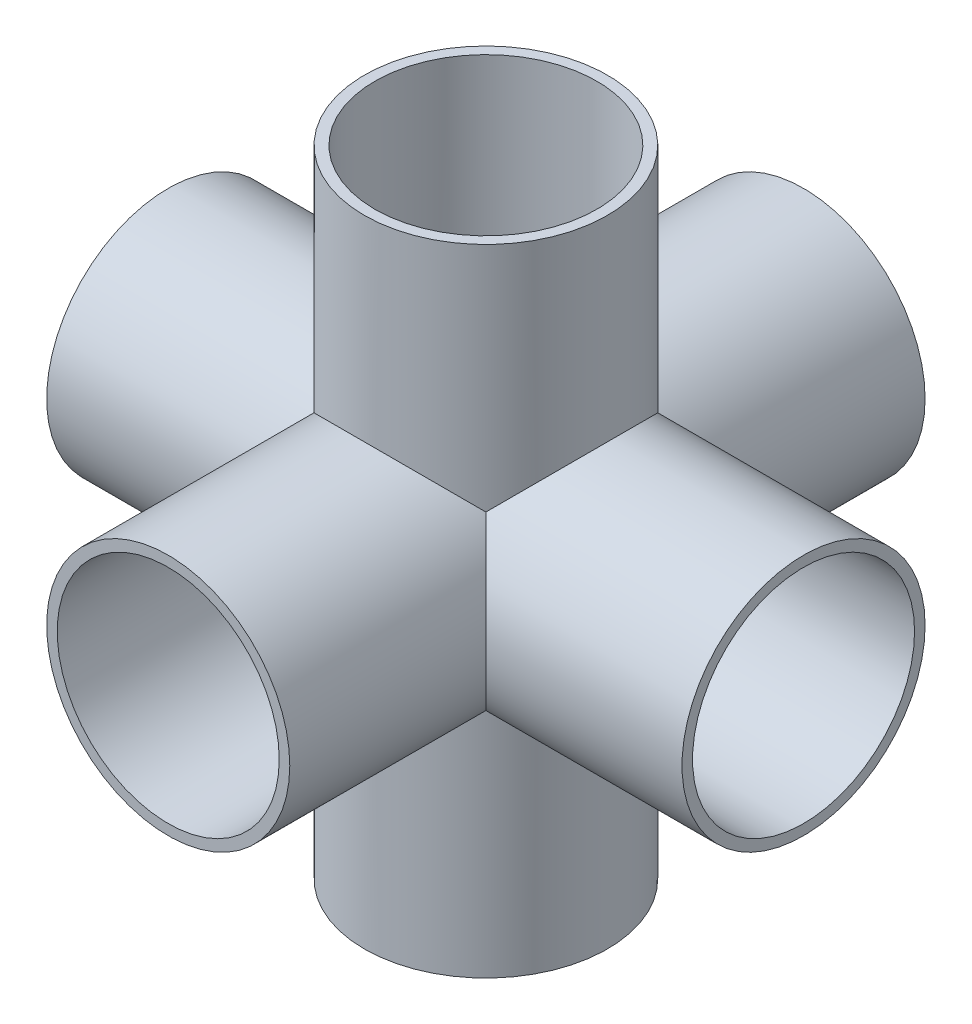
ISO-10303-21;
HEADER;
FILE_DESCRIPTION(('STEP AP214'),'2;1');
FILE_NAME('part.step','',(''),(''),'','','');
FILE_SCHEMA(('AUTOMOTIVE_DESIGN { 1 0 10303 214 1 1 1 1 }'));
ENDSEC;
DATA;
#1=APPLICATION_CONTEXT('core data for automotive mechanical design processes');
#2=APPLICATION_PROTOCOL_DEFINITION('international standard','automotive_design',2000,#1);
#3=PRODUCT_CONTEXT('',#1,'mechanical');
#4=PRODUCT('Part','Part','',(#3));
#5=PRODUCT_RELATED_PRODUCT_CATEGORY('part','',(#4));
#6=PRODUCT_DEFINITION_FORMATION('','',#4);
#7=PRODUCT_DEFINITION_CONTEXT('part definition',#1,'design');
#8=PRODUCT_DEFINITION('design','',#6,#7);
#9=PRODUCT_DEFINITION_SHAPE('','',#8);
#10=(LENGTH_UNIT() NAMED_UNIT(*) SI_UNIT(.MILLI.,.METRE.));
#11=(NAMED_UNIT(*) PLANE_ANGLE_UNIT() SI_UNIT($,.RADIAN.));
#12=(NAMED_UNIT(*) SI_UNIT($,.STERADIAN.) SOLID_ANGLE_UNIT());
#13=UNCERTAINTY_MEASURE_WITH_UNIT(LENGTH_MEASURE(1.E-05),#10,'distance_accuracy_value','');
#14=(GEOMETRIC_REPRESENTATION_CONTEXT(3) GLOBAL_UNCERTAINTY_ASSIGNED_CONTEXT((#13)) GLOBAL_UNIT_ASSIGNED_CONTEXT((#10,
#11,#12)) REPRESENTATION_CONTEXT('',''));
#15=CARTESIAN_POINT('',(0.,0.,0.));
#16=DIRECTION('',(0.,0.,1.));
#17=DIRECTION('',(1.,0.,0.));
#18=AXIS2_PLACEMENT_3D('',#15,#16,#17);
#19=CARTESIAN_POINT('',(0.,-49.784,0.));
#20=DIRECTION('',(0.,1.,0.));
#21=DIRECTION('',(0.,0.,1.));
#22=AXIS2_PLACEMENT_3D('',#19,#20,#21);
#23=CYLINDRICAL_SURFACE('',#22,17.399);
#24=CARTESIAN_POINT('',(0.,49.784,0.));
#25=DIRECTION('',(0.,1.,0.));
#26=DIRECTION('',(0.,0.,1.));
#27=AXIS2_PLACEMENT_3D('',#24,#25,#26);
#28=CIRCLE('',#27,17.399);
#29=CARTESIAN_POINT('',(0.,49.784,17.399));
#30=VERTEX_POINT('',#29);
#31=EDGE_CURVE('E137',#30,#30,#28,.T.);
#32=ORIENTED_EDGE('',*,*,#31,.T.);
#33=EDGE_LOOP('',(#32));
#34=FACE_BOUND('',#33,.T.);
#35=CARTESIAN_POINT('',(0.,0.,0.));
#36=DIRECTION('',(0.707106781186547,0.707106781186547,0.));
#37=DIRECTION('',(-0.707106781186547,0.707106781186547,0.));
#38=AXIS2_PLACEMENT_3D('',#35,#36,#37);
#39=ELLIPSE('',#38,24.6059017717295,17.399);
#40=CARTESIAN_POINT('',(-12.3029508858647,12.3029508858647,12.3029508858647));
#41=VERTEX_POINT('',#40);
#42=CARTESIAN_POINT('',(-12.3029508858647,12.3029508858647,-12.3029508858647));
#43=VERTEX_POINT('',#42);
#44=EDGE_CURVE('E99',#41,#43,#39,.F.);
#45=ORIENTED_EDGE('',*,*,#44,.T.);
#46=CARTESIAN_POINT('',(0.,0.,0.));
#47=DIRECTION('',(0.,0.707106781186547,0.707106781186547));
#48=DIRECTION('',(0.,0.707106781186547,-0.707106781186547));
#49=AXIS2_PLACEMENT_3D('',#46,#47,#48);
#50=ELLIPSE('',#49,24.6059017717295,17.399);
#51=CARTESIAN_POINT('',(12.3029508858647,12.3029508858647,-12.3029508858647));
#52=VERTEX_POINT('',#51);
#53=EDGE_CURVE('E45',#43,#52,#50,.F.);
#54=ORIENTED_EDGE('',*,*,#53,.T.);
#55=CARTESIAN_POINT('',(0.,0.,0.));
#56=DIRECTION('',(-0.707106781186547,0.707106781186547,0.));
#57=DIRECTION('',(0.707106781186547,0.707106781186547,0.));
#58=AXIS2_PLACEMENT_3D('',#55,#56,#57);
#59=ELLIPSE('',#58,24.6059017717295,17.399);
#60=CARTESIAN_POINT('',(12.3029508858647,12.3029508858647,12.3029508858647));
#61=VERTEX_POINT('',#60);
#62=EDGE_CURVE('E111',#52,#61,#59,.F.);
#63=ORIENTED_EDGE('',*,*,#62,.T.);
#64=CARTESIAN_POINT('',(0.,0.,0.));
#65=DIRECTION('',(0.,0.707106781186547,-0.707106781186547));
#66=DIRECTION('',(0.,0.707106781186547,0.707106781186547));
#67=AXIS2_PLACEMENT_3D('',#64,#65,#66);
#68=ELLIPSE('',#67,24.6059017717295,17.399);
#69=EDGE_CURVE('E122',#61,#41,#68,.F.);
#70=ORIENTED_EDGE('',*,*,#69,.T.);
#71=EDGE_LOOP('',(#45,#54,#63,#70));
#72=FACE_BOUND('',#71,.T.);
#73=ADVANCED_FACE('F30',(#34,#72),#23,.F.);
#74=CARTESIAN_POINT('',(0.,-49.784,0.));
#75=DIRECTION('',(0.,1.,0.));
#76=DIRECTION('',(0.,0.,1.));
#77=AXIS2_PLACEMENT_3D('',#74,#75,#76);
#78=CYLINDRICAL_SURFACE('',#77,19.05);
#79=CARTESIAN_POINT('',(0.,0.,0.));
#80=DIRECTION('',(0.707106781186547,0.707106781186547,0.));
#81=DIRECTION('',(-0.707106781186547,0.707106781186547,0.));
#82=AXIS2_PLACEMENT_3D('',#79,#80,#81);
#83=ELLIPSE('',#82,26.9407683632075,19.05);
#84=CARTESIAN_POINT('',(13.4703841816037,-13.4703841816037,13.4703841816037));
#85=VERTEX_POINT('',#84);
#86=CARTESIAN_POINT('',(13.4703841816037,-13.4703841816037,-13.4703841816037));
#87=VERTEX_POINT('',#86);
#88=EDGE_CURVE('E164',#85,#87,#83,.T.);
#89=ORIENTED_EDGE('',*,*,#88,.F.);
#90=CARTESIAN_POINT('',(0.,0.,0.));
#91=DIRECTION('',(0.,0.707106781186547,0.707106781186547));
#92=DIRECTION('',(0.,0.707106781186547,-0.707106781186547));
#93=AXIS2_PLACEMENT_3D('',#90,#91,#92);
#94=ELLIPSE('',#93,26.9407683632075,19.05);
#95=CARTESIAN_POINT('',(-13.4703841816037,-13.4703841816037,13.4703841816037));
#96=VERTEX_POINT('',#95);
#97=EDGE_CURVE('E184',#96,#85,#94,.T.);
#98=ORIENTED_EDGE('',*,*,#97,.F.);
#99=CARTESIAN_POINT('',(0.,0.,0.));
#100=DIRECTION('',(-0.707106781186547,0.707106781186547,0.));
#101=DIRECTION('',(0.707106781186547,0.707106781186547,0.));
#102=AXIS2_PLACEMENT_3D('',#99,#100,#101);
#103=ELLIPSE('',#102,26.9407683632075,19.05);
#104=CARTESIAN_POINT('',(-13.4703841816037,-13.4703841816037,-13.4703841816037));
#105=VERTEX_POINT('',#104);
#106=EDGE_CURVE('E155',#105,#96,#103,.T.);
#107=ORIENTED_EDGE('',*,*,#106,.F.);
#108=CARTESIAN_POINT('',(0.,0.,0.));
#109=DIRECTION('',(0.,0.707106781186547,-0.707106781186547));
#110=DIRECTION('',(0.,0.707106781186547,0.707106781186547));
#111=AXIS2_PLACEMENT_3D('',#108,#109,#110);
#112=ELLIPSE('',#111,26.9407683632075,19.05);
#113=EDGE_CURVE('E182',#87,#105,#112,.T.);
#114=ORIENTED_EDGE('',*,*,#113,.F.);
#115=EDGE_LOOP('',(#89,#98,#107,#114));
#116=FACE_BOUND('',#115,.T.);
#117=CARTESIAN_POINT('',(0.,-49.784,0.));
#118=DIRECTION('',(0.,1.,0.));
#119=DIRECTION('',(0.,0.,1.));
#120=AXIS2_PLACEMENT_3D('',#117,#118,#119);
#121=CIRCLE('',#120,19.05);
#122=CARTESIAN_POINT('',(0.,-49.784,19.05));
#123=VERTEX_POINT('',#122);
#124=EDGE_CURVE('E176',#123,#123,#121,.T.);
#125=ORIENTED_EDGE('',*,*,#124,.T.);
#126=EDGE_LOOP('',(#125));
#127=FACE_BOUND('',#126,.T.);
#128=ADVANCED_FACE('F32',(#116,#127),#78,.T.);
#129=CARTESIAN_POINT('',(0.,-49.784,0.));
#130=DIRECTION('',(0.,1.,0.));
#131=DIRECTION('',(0.,0.,1.));
#132=AXIS2_PLACEMENT_3D('',#129,#130,#131);
#133=PLANE('',#132);
#134=CARTESIAN_POINT('',(0.,-49.784,0.));
#135=DIRECTION('',(0.,1.,0.));
#136=DIRECTION('',(0.,0.,1.));
#137=AXIS2_PLACEMENT_3D('',#134,#135,#136);
#138=CIRCLE('',#137,17.399);
#139=CARTESIAN_POINT('',(0.,-49.784,17.399));
#140=VERTEX_POINT('',#139);
#141=EDGE_CURVE('E140',#140,#140,#138,.T.);
#142=ORIENTED_EDGE('',*,*,#141,.T.);
#143=EDGE_LOOP('',(#142));
#144=FACE_BOUND('',#143,.T.);
#145=ORIENTED_EDGE('',*,*,#124,.F.);
#146=EDGE_LOOP('',(#145));
#147=FACE_BOUND('',#146,.T.);
#148=ADVANCED_FACE('F222',(#144,#147),#133,.F.);
#149=CARTESIAN_POINT('',(0.,0.,49.784));
#150=DIRECTION('',(0.,0.,1.));
#151=DIRECTION('',(1.,0.,0.));
#152=AXIS2_PLACEMENT_3D('',#149,#150,#151);
#153=PLANE('',#152);
#154=CARTESIAN_POINT('',(0.,0.,49.784));
#155=DIRECTION('',(0.,0.,1.));
#156=DIRECTION('',(1.,0.,0.));
#157=AXIS2_PLACEMENT_3D('',#154,#155,#156);
#158=CIRCLE('',#157,17.399);
#159=CARTESIAN_POINT('',(17.399,0.,49.784));
#160=VERTEX_POINT('',#159);
#161=EDGE_CURVE('E355',#160,#160,#158,.T.);
#162=ORIENTED_EDGE('',*,*,#161,.F.);
#163=EDGE_LOOP('',(#162));
#164=FACE_BOUND('',#163,.T.);
#165=CARTESIAN_POINT('',(0.,0.,49.784));
#166=DIRECTION('',(0.,0.,1.));
#167=DIRECTION('',(1.,0.,0.));
#168=AXIS2_PLACEMENT_3D('',#165,#166,#167);
#169=CIRCLE('',#168,19.05);
#170=CARTESIAN_POINT('',(19.05,0.,49.784));
#171=VERTEX_POINT('',#170);
#172=EDGE_CURVE('E167',#171,#171,#169,.T.);
#173=ORIENTED_EDGE('',*,*,#172,.T.);
#174=EDGE_LOOP('',(#173));
#175=FACE_BOUND('',#174,.T.);
#176=ADVANCED_FACE('F217',(#164,#175),#153,.T.);
#177=CARTESIAN_POINT('',(0.,0.,-49.784));
#178=DIRECTION('',(0.,0.,1.));
#179=DIRECTION('',(1.,0.,0.));
#180=AXIS2_PLACEMENT_3D('',#177,#178,#179);
#181=CYLINDRICAL_SURFACE('',#180,19.05);
#182=CARTESIAN_POINT('',(0.,0.,0.));
#183=DIRECTION('',(0.707106781186547,0.,0.707106781186547));
#184=DIRECTION('',(-0.707106781186547,0.,0.707106781186547));
#185=AXIS2_PLACEMENT_3D('',#182,#183,#184);
#186=ELLIPSE('',#185,26.9407683632075,19.05);
#187=CARTESIAN_POINT('',(-13.4703841816037,13.4703841816037,13.4703841816037));
#188=VERTEX_POINT('',#187);
#189=EDGE_CURVE('E152',#96,#188,#186,.F.);
#190=ORIENTED_EDGE('',*,*,#189,.F.);
#191=ORIENTED_EDGE('',*,*,#97,.T.);
#192=CARTESIAN_POINT('',(0.,0.,0.));
#193=DIRECTION('',(-0.707106781186547,0.,0.707106781186547));
#194=DIRECTION('',(0.707106781186547,0.,0.707106781186547));
#195=AXIS2_PLACEMENT_3D('',#192,#193,#194);
#196=ELLIPSE('',#195,26.9407683632075,19.05);
#197=CARTESIAN_POINT('',(13.4703841816037,13.4703841816037,13.4703841816037));
#198=VERTEX_POINT('',#197);
#199=EDGE_CURVE('E161',#198,#85,#196,.F.);
#200=ORIENTED_EDGE('',*,*,#199,.F.);
#201=CARTESIAN_POINT('',(0.,0.,0.));
#202=DIRECTION('',(0.,0.707106781186547,-0.707106781186547));
#203=DIRECTION('',(0.,0.707106781186547,0.707106781186547));
#204=AXIS2_PLACEMENT_3D('',#201,#202,#203);
#205=ELLIPSE('',#204,26.9407683632075,19.05);
#206=EDGE_CURVE('E179',#198,#188,#205,.F.);
#207=ORIENTED_EDGE('',*,*,#206,.T.);
#208=EDGE_LOOP('',(#190,#191,#200,#207));
#209=FACE_BOUND('',#208,.T.);
#210=ORIENTED_EDGE('',*,*,#172,.F.);
#211=EDGE_LOOP('',(#210));
#212=FACE_BOUND('',#211,.T.);
#213=ADVANCED_FACE('F213',(#209,#212),#181,.T.);
#214=CARTESIAN_POINT('',(0.,49.784,0.));
#215=DIRECTION('',(0.,1.,0.));
#216=DIRECTION('',(0.,0.,1.));
#217=AXIS2_PLACEMENT_3D('',#214,#215,#216);
#218=PLANE('',#217);
#219=ORIENTED_EDGE('',*,*,#31,.F.);
#220=EDGE_LOOP('',(#219));
#221=FACE_BOUND('',#220,.T.);
#222=CARTESIAN_POINT('',(0.,49.784,0.));
#223=DIRECTION('',(0.,1.,0.));
#224=DIRECTION('',(0.,0.,1.));
#225=AXIS2_PLACEMENT_3D('',#222,#223,#224);
#226=CIRCLE('',#225,19.05);
#227=CARTESIAN_POINT('',(0.,49.784,19.05));
#228=VERTEX_POINT('',#227);
#229=EDGE_CURVE('E173',#228,#228,#226,.T.);
#230=ORIENTED_EDGE('',*,*,#229,.T.);
#231=EDGE_LOOP('',(#230));
#232=FACE_BOUND('',#231,.T.);
#233=ADVANCED_FACE('F216',(#221,#232),#218,.T.);
#234=CARTESIAN_POINT('',(0.,0.,0.));
#235=DIRECTION('',(0.707106781186547,0.707106781186547,0.));
#236=DIRECTION('',(-0.707106781186547,0.707106781186547,0.));
#237=AXIS2_PLACEMENT_3D('',#234,#235,#236);
#238=ELLIPSE('',#237,26.9407683632075,19.05);
#239=CARTESIAN_POINT('',(-13.4703841816037,13.4703841816037,-13.4703841816037));
#240=VERTEX_POINT('',#239);
#241=EDGE_CURVE('E149',#188,#240,#238,.F.);
#242=ORIENTED_EDGE('',*,*,#241,.F.);
#243=ORIENTED_EDGE('',*,*,#206,.F.);
#244=CARTESIAN_POINT('',(0.,0.,0.));
#245=DIRECTION('',(-0.707106781186547,0.707106781186547,0.));
#246=DIRECTION('',(0.707106781186547,0.707106781186547,0.));
#247=AXIS2_PLACEMENT_3D('',#244,#245,#246);
#248=ELLIPSE('',#247,26.9407683632075,19.05);
#249=CARTESIAN_POINT('',(13.4703841816037,13.4703841816037,-13.4703841816037));
#250=VERTEX_POINT('',#249);
#251=EDGE_CURVE('E158',#250,#198,#248,.F.);
#252=ORIENTED_EDGE('',*,*,#251,.F.);
#253=CARTESIAN_POINT('',(0.,0.,0.));
#254=DIRECTION('',(0.,0.707106781186547,0.707106781186547));
#255=DIRECTION('',(0.,0.707106781186547,-0.707106781186547));
#256=AXIS2_PLACEMENT_3D('',#253,#254,#255);
#257=ELLIPSE('',#256,26.9407683632075,19.05);
#258=EDGE_CURVE('E187',#240,#250,#257,.F.);
#259=ORIENTED_EDGE('',*,*,#258,.F.);
#260=EDGE_LOOP('',(#242,#243,#252,#259));
#261=FACE_BOUND('',#260,.T.);
#262=ORIENTED_EDGE('',*,*,#229,.F.);
#263=EDGE_LOOP('',(#262));
#264=FACE_BOUND('',#263,.T.);
#265=ADVANCED_FACE('F209',(#261,#264),#78,.T.);
#266=CARTESIAN_POINT('',(0.,0.,0.));
#267=DIRECTION('',(0.707106781186547,0.,0.707106781186547));
#268=DIRECTION('',(-0.707106781186547,0.,0.707106781186547));
#269=AXIS2_PLACEMENT_3D('',#266,#267,#268);
#270=ELLIPSE('',#269,26.9407683632075,19.05);
#271=EDGE_CURVE('E115',#87,#250,#270,.T.);
#272=ORIENTED_EDGE('',*,*,#271,.F.);
#273=ORIENTED_EDGE('',*,*,#113,.T.);
#274=CARTESIAN_POINT('',(0.,0.,0.));
#275=DIRECTION('',(-0.707106781186547,0.,0.707106781186547));
#276=DIRECTION('',(0.707106781186547,0.,0.707106781186547));
#277=AXIS2_PLACEMENT_3D('',#274,#275,#276);
#278=ELLIPSE('',#277,26.9407683632075,19.05);
#279=EDGE_CURVE('E189',#240,#105,#278,.T.);
#280=ORIENTED_EDGE('',*,*,#279,.F.);
#281=ORIENTED_EDGE('',*,*,#258,.T.);
#282=EDGE_LOOP('',(#272,#273,#280,#281));
#283=FACE_BOUND('',#282,.T.);
#284=CARTESIAN_POINT('',(0.,0.,-49.784));
#285=DIRECTION('',(0.,0.,1.));
#286=DIRECTION('',(1.,0.,0.));
#287=AXIS2_PLACEMENT_3D('',#284,#285,#286);
#288=CIRCLE('',#287,19.05);
#289=CARTESIAN_POINT('',(19.05,0.,-49.784));
#290=VERTEX_POINT('',#289);
#291=EDGE_CURVE('E170',#290,#290,#288,.T.);
#292=ORIENTED_EDGE('',*,*,#291,.T.);
#293=EDGE_LOOP('',(#292));
#294=FACE_BOUND('',#293,.T.);
#295=ADVANCED_FACE('F198',(#283,#294),#181,.T.);
#296=CARTESIAN_POINT('',(0.,0.,-49.784));
#297=DIRECTION('',(0.,0.,1.));
#298=DIRECTION('',(1.,0.,0.));
#299=AXIS2_PLACEMENT_3D('',#296,#297,#298);
#300=PLANE('',#299);
#301=CARTESIAN_POINT('',(0.,0.,-49.784));
#302=DIRECTION('',(0.,0.,1.));
#303=DIRECTION('',(1.,0.,0.));
#304=AXIS2_PLACEMENT_3D('',#301,#302,#303);
#305=CIRCLE('',#304,17.399);
#306=CARTESIAN_POINT('',(17.399,0.,-49.784));
#307=VERTEX_POINT('',#306);
#308=EDGE_CURVE('E108',#307,#307,#305,.T.);
#309=ORIENTED_EDGE('',*,*,#308,.T.);
#310=EDGE_LOOP('',(#309));
#311=FACE_BOUND('',#310,.T.);
#312=ORIENTED_EDGE('',*,*,#291,.F.);
#313=EDGE_LOOP('',(#312));
#314=FACE_BOUND('',#313,.T.);
#315=ADVANCED_FACE('F257',(#311,#314),#300,.F.);
#316=CARTESIAN_POINT('',(-49.784,0.,0.));
#317=DIRECTION('',(1.,0.,0.));
#318=DIRECTION('',(0.,0.,-1.));
#319=AXIS2_PLACEMENT_3D('',#316,#317,#318);
#320=PLANE('',#319);
#321=CARTESIAN_POINT('',(-49.784,0.,0.));
#322=DIRECTION('',(1.,0.,0.));
#323=DIRECTION('',(0.,0.,-1.));
#324=AXIS2_PLACEMENT_3D('',#321,#322,#323);
#325=CIRCLE('',#324,17.399);
#326=CARTESIAN_POINT('',(-49.784,0.,-17.399));
#327=VERTEX_POINT('',#326);
#328=EDGE_CURVE('E134',#327,#327,#325,.T.);
#329=ORIENTED_EDGE('',*,*,#328,.T.);
#330=EDGE_LOOP('',(#329));
#331=FACE_BOUND('',#330,.T.);
#332=CARTESIAN_POINT('',(-49.784,0.,0.));
#333=DIRECTION('',(1.,0.,0.));
#334=DIRECTION('',(0.,0.,-1.));
#335=AXIS2_PLACEMENT_3D('',#332,#333,#334);
#336=CIRCLE('',#335,19.05);
#337=CARTESIAN_POINT('',(-49.784,0.,-19.05));
#338=VERTEX_POINT('',#337);
#339=EDGE_CURVE('E146',#338,#338,#336,.T.);
#340=ORIENTED_EDGE('',*,*,#339,.F.);
#341=EDGE_LOOP('',(#340));
#342=FACE_BOUND('',#341,.T.);
#343=ADVANCED_FACE('F255',(#331,#342),#320,.F.);
#344=CARTESIAN_POINT('',(-49.784,0.,0.));
#345=DIRECTION('',(1.,0.,0.));
#346=DIRECTION('',(0.,0.,-1.));
#347=AXIS2_PLACEMENT_3D('',#344,#345,#346);
#348=CYLINDRICAL_SURFACE('',#347,19.05);
#349=ORIENTED_EDGE('',*,*,#279,.T.);
#350=ORIENTED_EDGE('',*,*,#106,.T.);
#351=ORIENTED_EDGE('',*,*,#189,.T.);
#352=ORIENTED_EDGE('',*,*,#241,.T.);
#353=EDGE_LOOP('',(#349,#350,#351,#352));
#354=FACE_BOUND('',#353,.T.);
#355=ORIENTED_EDGE('',*,*,#339,.T.);
#356=EDGE_LOOP('',(#355));
#357=FACE_BOUND('',#356,.T.);
#358=ADVANCED_FACE('F206',(#354,#357),#348,.T.);
#359=ORIENTED_EDGE('',*,*,#199,.T.);
#360=ORIENTED_EDGE('',*,*,#88,.T.);
#361=ORIENTED_EDGE('',*,*,#271,.T.);
#362=ORIENTED_EDGE('',*,*,#251,.T.);
#363=EDGE_LOOP('',(#359,#360,#361,#362));
#364=FACE_BOUND('',#363,.T.);
#365=CARTESIAN_POINT('',(49.784,0.,0.));
#366=DIRECTION('',(1.,0.,0.));
#367=DIRECTION('',(0.,0.,-1.));
#368=AXIS2_PLACEMENT_3D('',#365,#366,#367);
#369=CIRCLE('',#368,19.05);
#370=CARTESIAN_POINT('',(49.784,0.,-19.05));
#371=VERTEX_POINT('',#370);
#372=EDGE_CURVE('E143',#371,#371,#369,.T.);
#373=ORIENTED_EDGE('',*,*,#372,.F.);
#374=EDGE_LOOP('',(#373));
#375=FACE_BOUND('',#374,.T.);
#376=ADVANCED_FACE('F193',(#364,#375),#348,.T.);
#377=CARTESIAN_POINT('',(49.784,0.,0.));
#378=DIRECTION('',(1.,0.,0.));
#379=DIRECTION('',(0.,0.,-1.));
#380=AXIS2_PLACEMENT_3D('',#377,#378,#379);
#381=PLANE('',#380);
#382=CARTESIAN_POINT('',(49.784,0.,0.));
#383=DIRECTION('',(1.,0.,0.));
#384=DIRECTION('',(0.,0.,-1.));
#385=AXIS2_PLACEMENT_3D('',#382,#383,#384);
#386=CIRCLE('',#385,17.399);
#387=CARTESIAN_POINT('',(49.784,0.,-17.399));
#388=VERTEX_POINT('',#387);
#389=EDGE_CURVE('E126',#388,#388,#386,.T.);
#390=ORIENTED_EDGE('',*,*,#389,.F.);
#391=EDGE_LOOP('',(#390));
#392=FACE_BOUND('',#391,.T.);
#393=ORIENTED_EDGE('',*,*,#372,.T.);
#394=EDGE_LOOP('',(#393));
#395=FACE_BOUND('',#394,.T.);
#396=ADVANCED_FACE('F242',(#392,#395),#381,.T.);
#397=CARTESIAN_POINT('',(0.,0.,0.));
#398=DIRECTION('',(-0.707106781186547,0.707106781186547,0.));
#399=DIRECTION('',(0.707106781186547,0.707106781186547,0.));
#400=AXIS2_PLACEMENT_3D('',#397,#398,#399);
#401=ELLIPSE('',#400,24.6059017717295,17.399);
#402=CARTESIAN_POINT('',(-12.3029508858647,-12.3029508858647,-12.3029508858647));
#403=VERTEX_POINT('',#402);
#404=CARTESIAN_POINT('',(-12.3029508858647,-12.3029508858647,12.3029508858647));
#405=VERTEX_POINT('',#404);
#406=EDGE_CURVE('E105',#403,#405,#401,.T.);
#407=ORIENTED_EDGE('',*,*,#406,.T.);
#408=CARTESIAN_POINT('',(0.,0.,0.));
#409=DIRECTION('',(0.,0.707106781186547,0.707106781186547));
#410=DIRECTION('',(0.,0.707106781186547,-0.707106781186547));
#411=AXIS2_PLACEMENT_3D('',#408,#409,#410);
#412=ELLIPSE('',#411,24.6059017717295,17.399);
#413=CARTESIAN_POINT('',(12.3029508858647,-12.3029508858647,12.3029508858647));
#414=VERTEX_POINT('',#413);
#415=EDGE_CURVE('E53',#405,#414,#412,.T.);
#416=ORIENTED_EDGE('',*,*,#415,.T.);
#417=CARTESIAN_POINT('',(0.,0.,0.));
#418=DIRECTION('',(0.707106781186547,0.707106781186547,0.));
#419=DIRECTION('',(-0.707106781186547,0.707106781186547,0.));
#420=AXIS2_PLACEMENT_3D('',#417,#418,#419);
#421=ELLIPSE('',#420,24.6059017717295,17.399);
#422=CARTESIAN_POINT('',(12.3029508858647,-12.3029508858647,-12.3029508858647));
#423=VERTEX_POINT('',#422);
#424=EDGE_CURVE('E107',#414,#423,#421,.T.);
#425=ORIENTED_EDGE('',*,*,#424,.T.);
#426=CARTESIAN_POINT('',(0.,0.,0.));
#427=DIRECTION('',(0.,0.707106781186547,-0.707106781186547));
#428=DIRECTION('',(0.,0.707106781186547,0.707106781186547));
#429=AXIS2_PLACEMENT_3D('',#426,#427,#428);
#430=ELLIPSE('',#429,24.6059017717295,17.399);
#431=EDGE_CURVE('E93',#423,#403,#430,.T.);
#432=ORIENTED_EDGE('',*,*,#431,.T.);
#433=EDGE_LOOP('',(#407,#416,#425,#432));
#434=FACE_BOUND('',#433,.T.);
#435=ORIENTED_EDGE('',*,*,#141,.F.);
#436=EDGE_LOOP('',(#435));
#437=FACE_BOUND('',#436,.T.);
#438=ADVANCED_FACE('F103',(#434,#437),#23,.F.);
#439=CARTESIAN_POINT('',(-49.784,0.,0.));
#440=DIRECTION('',(1.,0.,0.));
#441=DIRECTION('',(0.,0.,-1.));
#442=AXIS2_PLACEMENT_3D('',#439,#440,#441);
#443=CYLINDRICAL_SURFACE('',#442,17.399);
#444=ORIENTED_EDGE('',*,*,#389,.T.);
#445=EDGE_LOOP('',(#444));
#446=FACE_BOUND('',#445,.T.);
#447=ORIENTED_EDGE('',*,*,#62,.F.);
#448=CARTESIAN_POINT('',(0.,0.,0.));
#449=DIRECTION('',(0.707106781186547,0.,0.707106781186547));
#450=DIRECTION('',(0.707106781186547,0.,-0.707106781186547));
#451=AXIS2_PLACEMENT_3D('',#448,#449,#450);
#452=ELLIPSE('',#451,24.6059017717295,17.399);
#453=EDGE_CURVE('E128',#52,#423,#452,.F.);
#454=ORIENTED_EDGE('',*,*,#453,.T.);
#455=ORIENTED_EDGE('',*,*,#424,.F.);
#456=CARTESIAN_POINT('',(0.,0.,0.));
#457=DIRECTION('',(0.707106781186547,0.,-0.707106781186547));
#458=DIRECTION('',(0.707106781186547,0.,0.707106781186547));
#459=AXIS2_PLACEMENT_3D('',#456,#457,#458);
#460=ELLIPSE('',#459,24.6059017717295,17.399);
#461=EDGE_CURVE('E124',#414,#61,#460,.F.);
#462=ORIENTED_EDGE('',*,*,#461,.T.);
#463=EDGE_LOOP('',(#447,#454,#455,#462));
#464=FACE_BOUND('',#463,.T.);
#465=ADVANCED_FACE('F241',(#446,#464),#443,.F.);
#466=ORIENTED_EDGE('',*,*,#328,.F.);
#467=EDGE_LOOP('',(#466));
#468=FACE_BOUND('',#467,.T.);
#469=ORIENTED_EDGE('',*,*,#44,.F.);
#470=CARTESIAN_POINT('',(0.,0.,0.));
#471=DIRECTION('',(0.707106781186547,0.,0.707106781186547));
#472=DIRECTION('',(0.707106781186547,0.,-0.707106781186547));
#473=AXIS2_PLACEMENT_3D('',#470,#471,#472);
#474=ELLIPSE('',#473,24.6059017717295,17.399);
#475=EDGE_CURVE('E11',#41,#405,#474,.T.);
#476=ORIENTED_EDGE('',*,*,#475,.T.);
#477=ORIENTED_EDGE('',*,*,#406,.F.);
#478=CARTESIAN_POINT('',(0.,0.,0.));
#479=DIRECTION('',(0.707106781186547,0.,-0.707106781186547));
#480=DIRECTION('',(0.707106781186547,0.,0.707106781186547));
#481=AXIS2_PLACEMENT_3D('',#478,#479,#480);
#482=ELLIPSE('',#481,24.6059017717295,17.399);
#483=EDGE_CURVE('E38',#403,#43,#482,.T.);
#484=ORIENTED_EDGE('',*,*,#483,.T.);
#485=EDGE_LOOP('',(#469,#476,#477,#484));
#486=FACE_BOUND('',#485,.T.);
#487=ADVANCED_FACE('F110',(#468,#486),#443,.F.);
#488=CARTESIAN_POINT('',(0.,0.,-49.784));
#489=DIRECTION('',(0.,0.,1.));
#490=DIRECTION('',(1.,0.,0.));
#491=AXIS2_PLACEMENT_3D('',#488,#489,#490);
#492=CYLINDRICAL_SURFACE('',#491,17.399);
#493=ORIENTED_EDGE('',*,*,#308,.F.);
#494=EDGE_LOOP('',(#493));
#495=FACE_BOUND('',#494,.T.);
#496=ORIENTED_EDGE('',*,*,#53,.F.);
#497=ORIENTED_EDGE('',*,*,#483,.F.);
#498=ORIENTED_EDGE('',*,*,#431,.F.);
#499=ORIENTED_EDGE('',*,*,#453,.F.);
#500=EDGE_LOOP('',(#496,#497,#498,#499));
#501=FACE_BOUND('',#500,.T.);
#502=ADVANCED_FACE('F92',(#495,#501),#492,.F.);
#503=ORIENTED_EDGE('',*,*,#161,.T.);
#504=EDGE_LOOP('',(#503));
#505=FACE_BOUND('',#504,.T.);
#506=ORIENTED_EDGE('',*,*,#415,.F.);
#507=ORIENTED_EDGE('',*,*,#475,.F.);
#508=ORIENTED_EDGE('',*,*,#69,.F.);
#509=ORIENTED_EDGE('',*,*,#461,.F.);
#510=EDGE_LOOP('',(#506,#507,#508,#509));
#511=FACE_BOUND('',#510,.T.);
#512=ADVANCED_FACE('F341',(#505,#511),#492,.F.);
#513=CLOSED_SHELL('',(#73,#128,#148,#176,#213,#233,#265,#295,#315,#343,#358,#376,#396,#438,#465,
#487,#502,#512));
#514=MANIFOLD_SOLID_BREP('B2',#513);
#515=ADVANCED_BREP_SHAPE_REPRESENTATION('',(#18,#514),#14);
#516=SHAPE_DEFINITION_REPRESENTATION(#9,#515);
ENDSEC;
END-ISO-10303-21;
